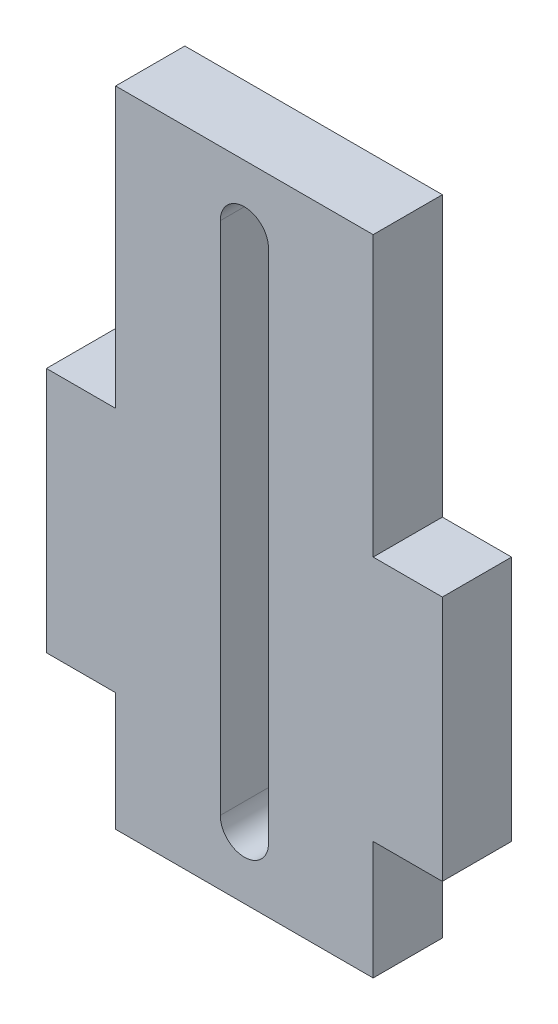
ISO-10303-21;
HEADER;
FILE_DESCRIPTION(('STEP AP214'),'2;1');
FILE_NAME('part.step','',(''),(''),'','','');
FILE_SCHEMA(('AUTOMOTIVE_DESIGN { 1 0 10303 214 1 1 1 1 }'));
ENDSEC;
DATA;
#1=APPLICATION_CONTEXT('core data for automotive mechanical design processes');
#2=APPLICATION_PROTOCOL_DEFINITION('international standard','automotive_design',2000,#1);
#3=PRODUCT_CONTEXT('',#1,'mechanical');
#4=PRODUCT('Part','Part','',(#3));
#5=PRODUCT_RELATED_PRODUCT_CATEGORY('part','',(#4));
#6=PRODUCT_DEFINITION_FORMATION('','',#4);
#7=PRODUCT_DEFINITION_CONTEXT('part definition',#1,'design');
#8=PRODUCT_DEFINITION('design','',#6,#7);
#9=PRODUCT_DEFINITION_SHAPE('','',#8);
#10=(LENGTH_UNIT() NAMED_UNIT(*) SI_UNIT(.MILLI.,.METRE.));
#11=(NAMED_UNIT(*) PLANE_ANGLE_UNIT() SI_UNIT($,.RADIAN.));
#12=(NAMED_UNIT(*) SI_UNIT($,.STERADIAN.) SOLID_ANGLE_UNIT());
#13=UNCERTAINTY_MEASURE_WITH_UNIT(LENGTH_MEASURE(1.E-05),#10,'distance_accuracy_value','');
#14=(GEOMETRIC_REPRESENTATION_CONTEXT(3) GLOBAL_UNCERTAINTY_ASSIGNED_CONTEXT((#13)) GLOBAL_UNIT_ASSIGNED_CONTEXT((#10,
#11,#12)) REPRESENTATION_CONTEXT('',''));
#15=CARTESIAN_POINT('',(0.,0.,0.));
#16=DIRECTION('',(0.,0.,1.));
#17=DIRECTION('',(1.,0.,0.));
#18=AXIS2_PLACEMENT_3D('',#15,#16,#17);
#19=CARTESIAN_POINT('',(0.,0.,4.3));
#20=DIRECTION('',(0.,0.,-1.));
#21=DIRECTION('',(-1.,0.,0.));
#22=AXIS2_PLACEMENT_3D('',#19,#20,#21);
#23=PLANE('',#22);
#24=DIRECTION('',(0.,1.,0.));
#25=VECTOR('',#24,1.);
#26=CARTESIAN_POINT('',(8.,2.65,4.3));
#27=LINE('',#26,#25);
#28=CARTESIAN_POINT('',(8.,2.65,4.3));
#29=VERTEX_POINT('',#28);
#30=CARTESIAN_POINT('',(8.,20.,4.3));
#31=VERTEX_POINT('',#30);
#32=EDGE_CURVE('E185',#29,#31,#27,.T.);
#33=ORIENTED_EDGE('',*,*,#32,.T.);
#34=DIRECTION('',(-1.,0.,0.));
#35=VECTOR('',#34,1.);
#36=CARTESIAN_POINT('',(-8.,20.,4.3));
#37=LINE('',#36,#35);
#38=CARTESIAN_POINT('',(-8.,20.,4.3));
#39=VERTEX_POINT('',#38);
#40=EDGE_CURVE('E188',#31,#39,#37,.T.);
#41=ORIENTED_EDGE('',*,*,#40,.T.);
#42=DIRECTION('',(0.,-1.,0.));
#43=VECTOR('',#42,1.);
#44=CARTESIAN_POINT('',(-8.,2.65000000000001,4.3));
#45=LINE('',#44,#43);
#46=CARTESIAN_POINT('',(-8.,2.65000000000001,4.3));
#47=VERTEX_POINT('',#46);
#48=EDGE_CURVE('E191',#39,#47,#45,.T.);
#49=ORIENTED_EDGE('',*,*,#48,.T.);
#50=DIRECTION('',(-1.,0.,0.));
#51=VECTOR('',#50,1.);
#52=CARTESIAN_POINT('',(-8.,2.65000000000001,4.3));
#53=LINE('',#52,#51);
#54=CARTESIAN_POINT('',(-12.3,2.65,4.3));
#55=VERTEX_POINT('',#54);
#56=EDGE_CURVE('E193',#47,#55,#53,.T.);
#57=ORIENTED_EDGE('',*,*,#56,.T.);
#58=DIRECTION('',(0.,-1.,0.));
#59=VECTOR('',#58,1.);
#60=CARTESIAN_POINT('',(-12.3,2.65,4.3));
#61=LINE('',#60,#59);
#62=CARTESIAN_POINT('',(-12.3,-12.65,4.3));
#63=VERTEX_POINT('',#62);
#64=EDGE_CURVE('E195',#55,#63,#61,.T.);
#65=ORIENTED_EDGE('',*,*,#64,.T.);
#66=DIRECTION('',(1.,0.,0.));
#67=VECTOR('',#66,1.);
#68=CARTESIAN_POINT('',(-7.99999999999999,-12.65,4.3));
#69=LINE('',#68,#67);
#70=CARTESIAN_POINT('',(-7.99999999999999,-12.65,4.3));
#71=VERTEX_POINT('',#70);
#72=EDGE_CURVE('E197',#63,#71,#69,.T.);
#73=ORIENTED_EDGE('',*,*,#72,.T.);
#74=DIRECTION('',(0.,-1.,0.));
#75=VECTOR('',#74,1.);
#76=CARTESIAN_POINT('',(-8.,-20.,4.3));
#77=LINE('',#76,#75);
#78=CARTESIAN_POINT('',(-8.,-20.,4.3));
#79=VERTEX_POINT('',#78);
#80=EDGE_CURVE('E199',#71,#79,#77,.T.);
#81=ORIENTED_EDGE('',*,*,#80,.T.);
#82=DIRECTION('',(1.,0.,0.));
#83=VECTOR('',#82,1.);
#84=CARTESIAN_POINT('',(-8.,-20.,4.3));
#85=LINE('',#84,#83);
#86=CARTESIAN_POINT('',(8.,-20.,4.3));
#87=VERTEX_POINT('',#86);
#88=EDGE_CURVE('E201',#79,#87,#85,.T.);
#89=ORIENTED_EDGE('',*,*,#88,.T.);
#90=DIRECTION('',(0.,1.,0.));
#91=VECTOR('',#90,1.);
#92=CARTESIAN_POINT('',(8.,-20.,4.3));
#93=LINE('',#92,#91);
#94=CARTESIAN_POINT('',(8.,-12.65,4.3));
#95=VERTEX_POINT('',#94);
#96=EDGE_CURVE('E203',#87,#95,#93,.T.);
#97=ORIENTED_EDGE('',*,*,#96,.T.);
#98=DIRECTION('',(1.,0.,0.));
#99=VECTOR('',#98,1.);
#100=CARTESIAN_POINT('',(8.,-12.65,4.3));
#101=LINE('',#100,#99);
#102=CARTESIAN_POINT('',(12.3,-12.65,4.3));
#103=VERTEX_POINT('',#102);
#104=EDGE_CURVE('E205',#95,#103,#101,.T.);
#105=ORIENTED_EDGE('',*,*,#104,.T.);
#106=DIRECTION('',(0.,1.,0.));
#107=VECTOR('',#106,1.);
#108=CARTESIAN_POINT('',(12.3,-12.65,4.3));
#109=LINE('',#108,#107);
#110=CARTESIAN_POINT('',(12.3,2.65,4.3));
#111=VERTEX_POINT('',#110);
#112=EDGE_CURVE('E207',#103,#111,#109,.T.);
#113=ORIENTED_EDGE('',*,*,#112,.T.);
#114=DIRECTION('',(-1.,0.,0.));
#115=VECTOR('',#114,1.);
#116=CARTESIAN_POINT('',(8.,2.65,4.3));
#117=LINE('',#116,#115);
#118=EDGE_CURVE('E209',#111,#29,#117,.T.);
#119=ORIENTED_EDGE('',*,*,#118,.T.);
#120=EDGE_LOOP('',(#33,#41,#49,#57,#65,#73,#81,#89,#97,#105,#113,#119));
#121=FACE_BOUND('',#120,.T.);
#122=CARTESIAN_POINT('',(0.,16.,4.3));
#123=DIRECTION('',(0.,0.,1.));
#124=DIRECTION('',(1.,0.,0.));
#125=AXIS2_PLACEMENT_3D('',#122,#123,#124);
#126=CIRCLE('',#125,1.5);
#127=CARTESIAN_POINT('',(1.5,16.,4.3));
#128=VERTEX_POINT('',#127);
#129=CARTESIAN_POINT('',(-1.5,16.,4.3));
#130=VERTEX_POINT('',#129);
#131=EDGE_CURVE('E149',#128,#130,#126,.T.);
#132=ORIENTED_EDGE('',*,*,#131,.F.);
#133=DIRECTION('',(0.,1.,0.));
#134=VECTOR('',#133,1.);
#135=CARTESIAN_POINT('',(1.5,16.,4.3));
#136=LINE('',#135,#134);
#137=CARTESIAN_POINT('',(1.5,-16.,4.3));
#138=VERTEX_POINT('',#137);
#139=EDGE_CURVE('E171',#138,#128,#136,.T.);
#140=ORIENTED_EDGE('',*,*,#139,.F.);
#141=CARTESIAN_POINT('',(0.,-16.,4.3));
#142=DIRECTION('',(0.,0.,1.));
#143=DIRECTION('',(1.,0.,0.));
#144=AXIS2_PLACEMENT_3D('',#141,#142,#143);
#145=CIRCLE('',#144,1.5);
#146=CARTESIAN_POINT('',(-1.5,-16.,4.3));
#147=VERTEX_POINT('',#146);
#148=EDGE_CURVE('E169',#147,#138,#145,.T.);
#149=ORIENTED_EDGE('',*,*,#148,.F.);
#150=DIRECTION('',(0.,-1.,0.));
#151=VECTOR('',#150,1.);
#152=CARTESIAN_POINT('',(-1.5,-16.,4.3));
#153=LINE('',#152,#151);
#154=EDGE_CURVE('E157',#130,#147,#153,.T.);
#155=ORIENTED_EDGE('',*,*,#154,.F.);
#156=EDGE_LOOP('',(#132,#140,#149,#155));
#157=FACE_BOUND('',#156,.T.);
#158=ADVANCED_FACE('F36',(#121,#157),#23,.F.);
#159=CARTESIAN_POINT('',(0.,0.,0.));
#160=DIRECTION('',(0.,0.,-1.));
#161=DIRECTION('',(-1.,0.,0.));
#162=AXIS2_PLACEMENT_3D('',#159,#160,#161);
#163=PLANE('',#162);
#164=DIRECTION('',(0.,1.,0.));
#165=VECTOR('',#164,1.);
#166=CARTESIAN_POINT('',(8.,2.65,0.));
#167=LINE('',#166,#165);
#168=CARTESIAN_POINT('',(8.,2.65,0.));
#169=VERTEX_POINT('',#168);
#170=CARTESIAN_POINT('',(8.,20.,0.));
#171=VERTEX_POINT('',#170);
#172=EDGE_CURVE('E165',#169,#171,#167,.T.);
#173=ORIENTED_EDGE('',*,*,#172,.F.);
#174=DIRECTION('',(-1.,0.,0.));
#175=VECTOR('',#174,1.);
#176=CARTESIAN_POINT('',(8.,2.65,0.));
#177=LINE('',#176,#175);
#178=CARTESIAN_POINT('',(12.3,2.65,0.));
#179=VERTEX_POINT('',#178);
#180=EDGE_CURVE('E189',#179,#169,#177,.T.);
#181=ORIENTED_EDGE('',*,*,#180,.F.);
#182=DIRECTION('',(0.,1.,0.));
#183=VECTOR('',#182,1.);
#184=CARTESIAN_POINT('',(12.3,-12.65,0.));
#185=LINE('',#184,#183);
#186=CARTESIAN_POINT('',(12.3,-12.65,0.));
#187=VERTEX_POINT('',#186);
#188=EDGE_CURVE('E232',#187,#179,#185,.T.);
#189=ORIENTED_EDGE('',*,*,#188,.F.);
#190=DIRECTION('',(1.,0.,0.));
#191=VECTOR('',#190,1.);
#192=CARTESIAN_POINT('',(8.,-12.65,0.));
#193=LINE('',#192,#191);
#194=CARTESIAN_POINT('',(8.,-12.65,0.));
#195=VERTEX_POINT('',#194);
#196=EDGE_CURVE('E230',#195,#187,#193,.T.);
#197=ORIENTED_EDGE('',*,*,#196,.F.);
#198=DIRECTION('',(0.,1.,0.));
#199=VECTOR('',#198,1.);
#200=CARTESIAN_POINT('',(8.,-20.,0.));
#201=LINE('',#200,#199);
#202=CARTESIAN_POINT('',(8.,-20.,0.));
#203=VERTEX_POINT('',#202);
#204=EDGE_CURVE('E228',#203,#195,#201,.T.);
#205=ORIENTED_EDGE('',*,*,#204,.F.);
#206=DIRECTION('',(1.,0.,0.));
#207=VECTOR('',#206,1.);
#208=CARTESIAN_POINT('',(-8.,-20.,0.));
#209=LINE('',#208,#207);
#210=CARTESIAN_POINT('',(-8.,-20.,0.));
#211=VERTEX_POINT('',#210);
#212=EDGE_CURVE('E226',#211,#203,#209,.T.);
#213=ORIENTED_EDGE('',*,*,#212,.F.);
#214=DIRECTION('',(0.,-1.,0.));
#215=VECTOR('',#214,1.);
#216=CARTESIAN_POINT('',(-8.,-20.,0.));
#217=LINE('',#216,#215);
#218=CARTESIAN_POINT('',(-7.99999999999999,-12.65,0.));
#219=VERTEX_POINT('',#218);
#220=EDGE_CURVE('E224',#219,#211,#217,.T.);
#221=ORIENTED_EDGE('',*,*,#220,.F.);
#222=DIRECTION('',(1.,0.,0.));
#223=VECTOR('',#222,1.);
#224=CARTESIAN_POINT('',(-7.99999999999999,-12.65,0.));
#225=LINE('',#224,#223);
#226=CARTESIAN_POINT('',(-12.3,-12.65,0.));
#227=VERTEX_POINT('',#226);
#228=EDGE_CURVE('E222',#227,#219,#225,.T.);
#229=ORIENTED_EDGE('',*,*,#228,.F.);
#230=DIRECTION('',(0.,-1.,0.));
#231=VECTOR('',#230,1.);
#232=CARTESIAN_POINT('',(-12.3,2.65,0.));
#233=LINE('',#232,#231);
#234=CARTESIAN_POINT('',(-12.3,2.65,0.));
#235=VERTEX_POINT('',#234);
#236=EDGE_CURVE('E220',#235,#227,#233,.T.);
#237=ORIENTED_EDGE('',*,*,#236,.F.);
#238=DIRECTION('',(-1.,0.,0.));
#239=VECTOR('',#238,1.);
#240=CARTESIAN_POINT('',(-8.,2.65000000000001,0.));
#241=LINE('',#240,#239);
#242=CARTESIAN_POINT('',(-8.,2.65000000000001,0.));
#243=VERTEX_POINT('',#242);
#244=EDGE_CURVE('E218',#243,#235,#241,.T.);
#245=ORIENTED_EDGE('',*,*,#244,.F.);
#246=DIRECTION('',(0.,-1.,0.));
#247=VECTOR('',#246,1.);
#248=CARTESIAN_POINT('',(-8.,2.65000000000001,0.));
#249=LINE('',#248,#247);
#250=CARTESIAN_POINT('',(-8.,20.,0.));
#251=VERTEX_POINT('',#250);
#252=EDGE_CURVE('E216',#251,#243,#249,.T.);
#253=ORIENTED_EDGE('',*,*,#252,.F.);
#254=DIRECTION('',(-1.,0.,0.));
#255=VECTOR('',#254,1.);
#256=CARTESIAN_POINT('',(-8.,20.,0.));
#257=LINE('',#256,#255);
#258=EDGE_CURVE('E214',#171,#251,#257,.T.);
#259=ORIENTED_EDGE('',*,*,#258,.F.);
#260=EDGE_LOOP('',(#173,#181,#189,#197,#205,#213,#221,#229,#237,#245,#253,#259));
#261=FACE_BOUND('',#260,.T.);
#262=DIRECTION('',(0.,1.,0.));
#263=VECTOR('',#262,1.);
#264=CARTESIAN_POINT('',(1.5,16.,0.));
#265=LINE('',#264,#263);
#266=CARTESIAN_POINT('',(1.5,-16.,0.));
#267=VERTEX_POINT('',#266);
#268=CARTESIAN_POINT('',(1.5,16.,0.));
#269=VERTEX_POINT('',#268);
#270=EDGE_CURVE('E158',#267,#269,#265,.T.);
#271=ORIENTED_EDGE('',*,*,#270,.T.);
#272=CARTESIAN_POINT('',(0.,16.,0.));
#273=DIRECTION('',(0.,0.,1.));
#274=DIRECTION('',(1.,0.,0.));
#275=AXIS2_PLACEMENT_3D('',#272,#273,#274);
#276=CIRCLE('',#275,1.5);
#277=CARTESIAN_POINT('',(-1.5,16.,0.));
#278=VERTEX_POINT('',#277);
#279=EDGE_CURVE('E59',#269,#278,#276,.T.);
#280=ORIENTED_EDGE('',*,*,#279,.T.);
#281=DIRECTION('',(0.,-1.,0.));
#282=VECTOR('',#281,1.);
#283=CARTESIAN_POINT('',(-1.5,-16.,0.));
#284=LINE('',#283,#282);
#285=CARTESIAN_POINT('',(-1.5,-16.,0.));
#286=VERTEX_POINT('',#285);
#287=EDGE_CURVE('E164',#278,#286,#284,.T.);
#288=ORIENTED_EDGE('',*,*,#287,.T.);
#289=CARTESIAN_POINT('',(0.,-16.,0.));
#290=DIRECTION('',(0.,0.,1.));
#291=DIRECTION('',(1.,0.,0.));
#292=AXIS2_PLACEMENT_3D('',#289,#290,#291);
#293=CIRCLE('',#292,1.5);
#294=EDGE_CURVE('E177',#286,#267,#293,.T.);
#295=ORIENTED_EDGE('',*,*,#294,.T.);
#296=EDGE_LOOP('',(#271,#280,#288,#295));
#297=FACE_BOUND('',#296,.T.);
#298=ADVANCED_FACE('F274',(#261,#297),#163,.T.);
#299=CARTESIAN_POINT('',(8.,2.65,4.3));
#300=DIRECTION('',(-1.,0.,0.));
#301=DIRECTION('',(0.,0.,1.));
#302=AXIS2_PLACEMENT_3D('',#299,#300,#301);
#303=PLANE('',#302);
#304=ORIENTED_EDGE('',*,*,#172,.T.);
#305=DIRECTION('',(0.,0.,-1.));
#306=VECTOR('',#305,1.);
#307=CARTESIAN_POINT('',(8.,20.,4.3));
#308=LINE('',#307,#306);
#309=EDGE_CURVE('E11',#31,#171,#308,.T.);
#310=ORIENTED_EDGE('',*,*,#309,.F.);
#311=ORIENTED_EDGE('',*,*,#32,.F.);
#312=DIRECTION('',(0.,0.,-1.));
#313=VECTOR('',#312,1.);
#314=CARTESIAN_POINT('',(8.,2.65,4.3));
#315=LINE('',#314,#313);
#316=EDGE_CURVE('E211',#29,#169,#315,.T.);
#317=ORIENTED_EDGE('',*,*,#316,.T.);
#318=EDGE_LOOP('',(#304,#310,#311,#317));
#319=FACE_BOUND('',#318,.T.);
#320=ADVANCED_FACE('F38',(#319),#303,.F.);
#321=CARTESIAN_POINT('',(-8.,20.,4.3));
#322=DIRECTION('',(0.,-1.,0.));
#323=DIRECTION('',(0.,0.,-1.));
#324=AXIS2_PLACEMENT_3D('',#321,#322,#323);
#325=PLANE('',#324);
#326=ORIENTED_EDGE('',*,*,#258,.T.);
#327=DIRECTION('',(0.,0.,-1.));
#328=VECTOR('',#327,1.);
#329=CARTESIAN_POINT('',(-8.,20.,4.3));
#330=LINE('',#329,#328);
#331=EDGE_CURVE('E44',#39,#251,#330,.T.);
#332=ORIENTED_EDGE('',*,*,#331,.F.);
#333=ORIENTED_EDGE('',*,*,#40,.F.);
#334=ORIENTED_EDGE('',*,*,#309,.T.);
#335=EDGE_LOOP('',(#326,#332,#333,#334));
#336=FACE_BOUND('',#335,.T.);
#337=ADVANCED_FACE('F291',(#336),#325,.F.);
#338=CARTESIAN_POINT('',(-8.,2.65000000000001,4.3));
#339=DIRECTION('',(1.,0.,0.));
#340=DIRECTION('',(0.,0.,-1.));
#341=AXIS2_PLACEMENT_3D('',#338,#339,#340);
#342=PLANE('',#341);
#343=ORIENTED_EDGE('',*,*,#252,.T.);
#344=DIRECTION('',(0.,0.,-1.));
#345=VECTOR('',#344,1.);
#346=CARTESIAN_POINT('',(-8.,2.65000000000001,4.3));
#347=LINE('',#346,#345);
#348=EDGE_CURVE('E261',#47,#243,#347,.T.);
#349=ORIENTED_EDGE('',*,*,#348,.F.);
#350=ORIENTED_EDGE('',*,*,#48,.F.);
#351=ORIENTED_EDGE('',*,*,#331,.T.);
#352=EDGE_LOOP('',(#343,#349,#350,#351));
#353=FACE_BOUND('',#352,.T.);
#354=ADVANCED_FACE('F268',(#353),#342,.F.);
#355=CARTESIAN_POINT('',(-8.,2.65000000000001,4.3));
#356=DIRECTION('',(0.,-1.,0.));
#357=DIRECTION('',(1.,0.,0.));
#358=AXIS2_PLACEMENT_3D('',#355,#356,#357);
#359=PLANE('',#358);
#360=ORIENTED_EDGE('',*,*,#244,.T.);
#361=DIRECTION('',(0.,0.,-1.));
#362=VECTOR('',#361,1.);
#363=CARTESIAN_POINT('',(-12.3,2.65,4.3));
#364=LINE('',#363,#362);
#365=EDGE_CURVE('E258',#55,#235,#364,.T.);
#366=ORIENTED_EDGE('',*,*,#365,.F.);
#367=ORIENTED_EDGE('',*,*,#56,.F.);
#368=ORIENTED_EDGE('',*,*,#348,.T.);
#369=EDGE_LOOP('',(#360,#366,#367,#368));
#370=FACE_BOUND('',#369,.T.);
#371=ADVANCED_FACE('F280',(#370),#359,.F.);
#372=CARTESIAN_POINT('',(-12.3,2.65,4.3));
#373=DIRECTION('',(1.,0.,0.));
#374=DIRECTION('',(0.,1.,0.));
#375=AXIS2_PLACEMENT_3D('',#372,#373,#374);
#376=PLANE('',#375);
#377=ORIENTED_EDGE('',*,*,#236,.T.);
#378=DIRECTION('',(0.,0.,-1.));
#379=VECTOR('',#378,1.);
#380=CARTESIAN_POINT('',(-12.3,-12.65,4.3));
#381=LINE('',#380,#379);
#382=EDGE_CURVE('E255',#63,#227,#381,.T.);
#383=ORIENTED_EDGE('',*,*,#382,.F.);
#384=ORIENTED_EDGE('',*,*,#64,.F.);
#385=ORIENTED_EDGE('',*,*,#365,.T.);
#386=EDGE_LOOP('',(#377,#383,#384,#385));
#387=FACE_BOUND('',#386,.T.);
#388=ADVANCED_FACE('F284',(#387),#376,.F.);
#389=CARTESIAN_POINT('',(-7.99999999999999,-12.65,4.3));
#390=DIRECTION('',(0.,1.,0.));
#391=DIRECTION('',(0.,0.,1.));
#392=AXIS2_PLACEMENT_3D('',#389,#390,#391);
#393=PLANE('',#392);
#394=ORIENTED_EDGE('',*,*,#228,.T.);
#395=DIRECTION('',(0.,0.,-1.));
#396=VECTOR('',#395,1.);
#397=CARTESIAN_POINT('',(-7.99999999999999,-12.65,4.3));
#398=LINE('',#397,#396);
#399=EDGE_CURVE('E252',#71,#219,#398,.T.);
#400=ORIENTED_EDGE('',*,*,#399,.F.);
#401=ORIENTED_EDGE('',*,*,#72,.F.);
#402=ORIENTED_EDGE('',*,*,#382,.T.);
#403=EDGE_LOOP('',(#394,#400,#401,#402));
#404=FACE_BOUND('',#403,.T.);
#405=ADVANCED_FACE('F324',(#404),#393,.F.);
#406=CARTESIAN_POINT('',(-8.,-20.,4.3));
#407=DIRECTION('',(1.,0.,0.));
#408=DIRECTION('',(0.,1.,0.));
#409=AXIS2_PLACEMENT_3D('',#406,#407,#408);
#410=PLANE('',#409);
#411=ORIENTED_EDGE('',*,*,#220,.T.);
#412=DIRECTION('',(0.,0.,-1.));
#413=VECTOR('',#412,1.);
#414=CARTESIAN_POINT('',(-8.,-20.,4.3));
#415=LINE('',#414,#413);
#416=EDGE_CURVE('E249',#79,#211,#415,.T.);
#417=ORIENTED_EDGE('',*,*,#416,.F.);
#418=ORIENTED_EDGE('',*,*,#80,.F.);
#419=ORIENTED_EDGE('',*,*,#399,.T.);
#420=EDGE_LOOP('',(#411,#417,#418,#419));
#421=FACE_BOUND('',#420,.T.);
#422=ADVANCED_FACE('F322',(#421),#410,.F.);
#423=CARTESIAN_POINT('',(-8.,-20.,4.3));
#424=DIRECTION('',(0.,1.,0.));
#425=DIRECTION('',(0.,0.,1.));
#426=AXIS2_PLACEMENT_3D('',#423,#424,#425);
#427=PLANE('',#426);
#428=ORIENTED_EDGE('',*,*,#212,.T.);
#429=DIRECTION('',(0.,0.,-1.));
#430=VECTOR('',#429,1.);
#431=CARTESIAN_POINT('',(8.,-20.,4.3));
#432=LINE('',#431,#430);
#433=EDGE_CURVE('E246',#87,#203,#432,.T.);
#434=ORIENTED_EDGE('',*,*,#433,.F.);
#435=ORIENTED_EDGE('',*,*,#88,.F.);
#436=ORIENTED_EDGE('',*,*,#416,.T.);
#437=EDGE_LOOP('',(#428,#434,#435,#436));
#438=FACE_BOUND('',#437,.T.);
#439=ADVANCED_FACE('F318',(#438),#427,.F.);
#440=CARTESIAN_POINT('',(8.,-20.,4.3));
#441=DIRECTION('',(-1.,0.,0.));
#442=DIRECTION('',(0.,-1.,0.));
#443=AXIS2_PLACEMENT_3D('',#440,#441,#442);
#444=PLANE('',#443);
#445=ORIENTED_EDGE('',*,*,#204,.T.);
#446=DIRECTION('',(0.,0.,-1.));
#447=VECTOR('',#446,1.);
#448=CARTESIAN_POINT('',(8.,-12.65,4.3));
#449=LINE('',#448,#447);
#450=EDGE_CURVE('E243',#95,#195,#449,.T.);
#451=ORIENTED_EDGE('',*,*,#450,.F.);
#452=ORIENTED_EDGE('',*,*,#96,.F.);
#453=ORIENTED_EDGE('',*,*,#433,.T.);
#454=EDGE_LOOP('',(#445,#451,#452,#453));
#455=FACE_BOUND('',#454,.T.);
#456=ADVANCED_FACE('F313',(#455),#444,.F.);
#457=CARTESIAN_POINT('',(8.,-12.65,4.3));
#458=DIRECTION('',(0.,1.,0.));
#459=DIRECTION('',(-1.,0.,0.));
#460=AXIS2_PLACEMENT_3D('',#457,#458,#459);
#461=PLANE('',#460);
#462=ORIENTED_EDGE('',*,*,#196,.T.);
#463=DIRECTION('',(0.,0.,-1.));
#464=VECTOR('',#463,1.);
#465=CARTESIAN_POINT('',(12.3,-12.65,4.3));
#466=LINE('',#465,#464);
#467=EDGE_CURVE('E240',#103,#187,#466,.T.);
#468=ORIENTED_EDGE('',*,*,#467,.F.);
#469=ORIENTED_EDGE('',*,*,#104,.F.);
#470=ORIENTED_EDGE('',*,*,#450,.T.);
#471=EDGE_LOOP('',(#462,#468,#469,#470));
#472=FACE_BOUND('',#471,.T.);
#473=ADVANCED_FACE('F307',(#472),#461,.F.);
#474=CARTESIAN_POINT('',(12.3,-12.65,4.3));
#475=DIRECTION('',(-1.,0.,0.));
#476=DIRECTION('',(0.,-1.,0.));
#477=AXIS2_PLACEMENT_3D('',#474,#475,#476);
#478=PLANE('',#477);
#479=ORIENTED_EDGE('',*,*,#188,.T.);
#480=DIRECTION('',(0.,0.,-1.));
#481=VECTOR('',#480,1.);
#482=CARTESIAN_POINT('',(12.3,2.65,4.3));
#483=LINE('',#482,#481);
#484=EDGE_CURVE('E237',#111,#179,#483,.T.);
#485=ORIENTED_EDGE('',*,*,#484,.F.);
#486=ORIENTED_EDGE('',*,*,#112,.F.);
#487=ORIENTED_EDGE('',*,*,#467,.T.);
#488=EDGE_LOOP('',(#479,#485,#486,#487));
#489=FACE_BOUND('',#488,.T.);
#490=ADVANCED_FACE('F303',(#489),#478,.F.);
#491=CARTESIAN_POINT('',(8.,2.65,4.3));
#492=DIRECTION('',(0.,-1.,0.));
#493=DIRECTION('',(0.,0.,-1.));
#494=AXIS2_PLACEMENT_3D('',#491,#492,#493);
#495=PLANE('',#494);
#496=ORIENTED_EDGE('',*,*,#180,.T.);
#497=ORIENTED_EDGE('',*,*,#316,.F.);
#498=ORIENTED_EDGE('',*,*,#118,.F.);
#499=ORIENTED_EDGE('',*,*,#484,.T.);
#500=EDGE_LOOP('',(#496,#497,#498,#499));
#501=FACE_BOUND('',#500,.T.);
#502=ADVANCED_FACE('F298',(#501),#495,.F.);
#503=CARTESIAN_POINT('',(0.,16.,4.3));
#504=DIRECTION('',(0.,0.,-1.));
#505=DIRECTION('',(-1.,0.,0.));
#506=AXIS2_PLACEMENT_3D('',#503,#504,#505);
#507=CYLINDRICAL_SURFACE('',#506,1.5);
#508=ORIENTED_EDGE('',*,*,#279,.F.);
#509=DIRECTION('',(0.,0.,-1.));
#510=VECTOR('',#509,1.);
#511=CARTESIAN_POINT('',(1.5,16.,4.3));
#512=LINE('',#511,#510);
#513=EDGE_CURVE('E153',#128,#269,#512,.T.);
#514=ORIENTED_EDGE('',*,*,#513,.F.);
#515=ORIENTED_EDGE('',*,*,#131,.T.);
#516=DIRECTION('',(0.,0.,-1.));
#517=VECTOR('',#516,1.);
#518=CARTESIAN_POINT('',(-1.5,16.,4.3));
#519=LINE('',#518,#517);
#520=EDGE_CURVE('E152',#130,#278,#519,.T.);
#521=ORIENTED_EDGE('',*,*,#520,.T.);
#522=EDGE_LOOP('',(#508,#514,#515,#521));
#523=FACE_BOUND('',#522,.T.);
#524=ADVANCED_FACE('F151',(#523),#507,.F.);
#525=CARTESIAN_POINT('',(-1.5,-16.,4.3));
#526=DIRECTION('',(1.,0.,0.));
#527=DIRECTION('',(0.,1.,0.));
#528=AXIS2_PLACEMENT_3D('',#525,#526,#527);
#529=PLANE('',#528);
#530=ORIENTED_EDGE('',*,*,#287,.F.);
#531=ORIENTED_EDGE('',*,*,#520,.F.);
#532=ORIENTED_EDGE('',*,*,#154,.T.);
#533=DIRECTION('',(0.,0.,-1.));
#534=VECTOR('',#533,1.);
#535=CARTESIAN_POINT('',(-1.5,-16.,4.3));
#536=LINE('',#535,#534);
#537=EDGE_CURVE('E166',#147,#286,#536,.T.);
#538=ORIENTED_EDGE('',*,*,#537,.T.);
#539=EDGE_LOOP('',(#530,#531,#532,#538));
#540=FACE_BOUND('',#539,.T.);
#541=ADVANCED_FACE('F161',(#540),#529,.T.);
#542=CARTESIAN_POINT('',(0.,-16.,4.3));
#543=DIRECTION('',(0.,0.,-1.));
#544=DIRECTION('',(-1.,0.,0.));
#545=AXIS2_PLACEMENT_3D('',#542,#543,#544);
#546=CYLINDRICAL_SURFACE('',#545,1.5);
#547=ORIENTED_EDGE('',*,*,#294,.F.);
#548=ORIENTED_EDGE('',*,*,#537,.F.);
#549=ORIENTED_EDGE('',*,*,#148,.T.);
#550=DIRECTION('',(0.,0.,-1.));
#551=VECTOR('',#550,1.);
#552=CARTESIAN_POINT('',(1.5,-16.,4.3));
#553=LINE('',#552,#551);
#554=EDGE_CURVE('E51',#138,#267,#553,.T.);
#555=ORIENTED_EDGE('',*,*,#554,.T.);
#556=EDGE_LOOP('',(#547,#548,#549,#555));
#557=FACE_BOUND('',#556,.T.);
#558=ADVANCED_FACE('F382',(#557),#546,.F.);
#559=CARTESIAN_POINT('',(1.5,16.,4.3));
#560=DIRECTION('',(-1.,0.,0.));
#561=DIRECTION('',(0.,-1.,0.));
#562=AXIS2_PLACEMENT_3D('',#559,#560,#561);
#563=PLANE('',#562);
#564=ORIENTED_EDGE('',*,*,#270,.F.);
#565=ORIENTED_EDGE('',*,*,#554,.F.);
#566=ORIENTED_EDGE('',*,*,#139,.T.);
#567=ORIENTED_EDGE('',*,*,#513,.T.);
#568=EDGE_LOOP('',(#564,#565,#566,#567));
#569=FACE_BOUND('',#568,.T.);
#570=ADVANCED_FACE('F388',(#569),#563,.T.);
#571=CLOSED_SHELL('',(#158,#298,#320,#337,#354,#371,#388,#405,#422,#439,#456,#473,#490,#502,
#524,#541,#558,#570));
#572=MANIFOLD_SOLID_BREP('B2',#571);
#573=ADVANCED_BREP_SHAPE_REPRESENTATION('',(#18,#572),#14);
#574=SHAPE_DEFINITION_REPRESENTATION(#9,#573);
ENDSEC;
END-ISO-10303-21;
